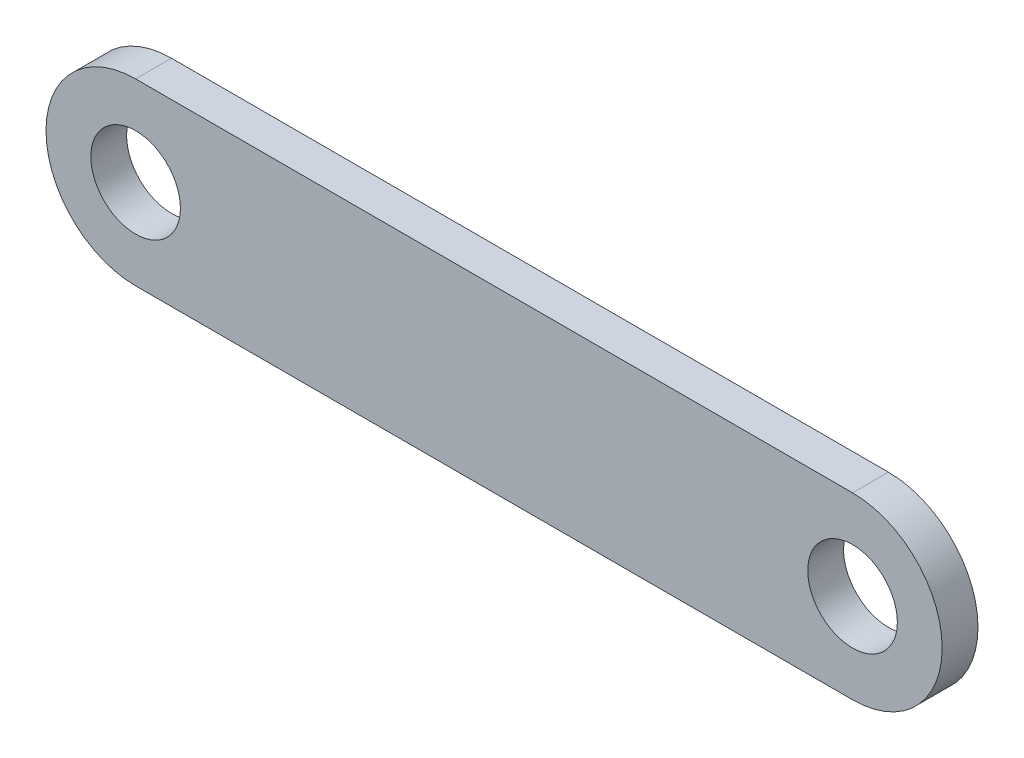
ISO-10303-21;
HEADER;
FILE_DESCRIPTION(('STEP AP214'),'2;1');
FILE_NAME('part.step','',(''),(''),'','','');
FILE_SCHEMA(('AUTOMOTIVE_DESIGN { 1 0 10303 214 1 1 1 1 }'));
ENDSEC;
DATA;
#1=APPLICATION_CONTEXT('core data for automotive mechanical design processes');
#2=APPLICATION_PROTOCOL_DEFINITION('international standard','automotive_design',2000,#1);
#3=PRODUCT_CONTEXT('',#1,'mechanical');
#4=PRODUCT('Part','Part','',(#3));
#5=PRODUCT_RELATED_PRODUCT_CATEGORY('part','',(#4));
#6=PRODUCT_DEFINITION_FORMATION('','',#4);
#7=PRODUCT_DEFINITION_CONTEXT('part definition',#1,'design');
#8=PRODUCT_DEFINITION('design','',#6,#7);
#9=PRODUCT_DEFINITION_SHAPE('','',#8);
#10=(LENGTH_UNIT() NAMED_UNIT(*) SI_UNIT(.MILLI.,.METRE.));
#11=(NAMED_UNIT(*) PLANE_ANGLE_UNIT() SI_UNIT($,.RADIAN.));
#12=(NAMED_UNIT(*) SI_UNIT($,.STERADIAN.) SOLID_ANGLE_UNIT());
#13=UNCERTAINTY_MEASURE_WITH_UNIT(LENGTH_MEASURE(1.E-05),#10,'distance_accuracy_value','');
#14=(GEOMETRIC_REPRESENTATION_CONTEXT(3) GLOBAL_UNCERTAINTY_ASSIGNED_CONTEXT((#13)) GLOBAL_UNIT_ASSIGNED_CONTEXT((#10,
#11,#12)) REPRESENTATION_CONTEXT('',''));
#15=CARTESIAN_POINT('',(0.,0.,0.));
#16=DIRECTION('',(0.,0.,1.));
#17=DIRECTION('',(1.,0.,0.));
#18=AXIS2_PLACEMENT_3D('',#15,#16,#17);
#19=CARTESIAN_POINT('',(0.,0.,2.));
#20=DIRECTION('',(0.,0.,1.));
#21=DIRECTION('',(1.,0.,0.));
#22=AXIS2_PLACEMENT_3D('',#19,#20,#21);
#23=PLANE('',#22);
#24=CARTESIAN_POINT('',(0.,0.,2.));
#25=DIRECTION('',(0.,0.,1.));
#26=DIRECTION('',(1.,0.,0.));
#27=AXIS2_PLACEMENT_3D('',#24,#25,#26);
#28=CIRCLE('',#27,5.);
#29=CARTESIAN_POINT('',(5.,0.,2.));
#30=VERTEX_POINT('',#29);
#31=EDGE_CURVE('E92',#30,#30,#28,.T.);
#32=ORIENTED_EDGE('',*,*,#31,.F.);
#33=EDGE_LOOP('',(#32));
#34=FACE_BOUND('',#33,.T.);
#35=CARTESIAN_POINT('',(0.,0.,2.));
#36=DIRECTION('',(0.,0.,1.));
#37=DIRECTION('',(1.,0.,0.));
#38=AXIS2_PLACEMENT_3D('',#35,#36,#37);
#39=CIRCLE('',#38,10.);
#40=CARTESIAN_POINT('',(0.,10.,2.));
#41=VERTEX_POINT('',#40);
#42=CARTESIAN_POINT('',(0.,-10.,2.));
#43=VERTEX_POINT('',#42);
#44=EDGE_CURVE('E102',#41,#43,#39,.T.);
#45=ORIENTED_EDGE('',*,*,#44,.T.);
#46=DIRECTION('',(1.,0.,0.));
#47=VECTOR('',#46,1.);
#48=CARTESIAN_POINT('',(80.,-9.99999999999999,2.));
#49=LINE('',#48,#47);
#50=CARTESIAN_POINT('',(80.,-9.99999999999999,2.));
#51=VERTEX_POINT('',#50);
#52=EDGE_CURVE('E87',#43,#51,#49,.T.);
#53=ORIENTED_EDGE('',*,*,#52,.T.);
#54=CARTESIAN_POINT('',(80.,0.,2.));
#55=DIRECTION('',(0.,0.,1.));
#56=DIRECTION('',(-1.,0.,0.));
#57=AXIS2_PLACEMENT_3D('',#54,#55,#56);
#58=CIRCLE('',#57,10.);
#59=CARTESIAN_POINT('',(80.,10.,2.));
#60=VERTEX_POINT('',#59);
#61=EDGE_CURVE('E53',#51,#60,#58,.T.);
#62=ORIENTED_EDGE('',*,*,#61,.T.);
#63=DIRECTION('',(-1.,0.,0.));
#64=VECTOR('',#63,1.);
#65=CARTESIAN_POINT('',(0.,10.,2.));
#66=LINE('',#65,#64);
#67=EDGE_CURVE('E48',#60,#41,#66,.T.);
#68=ORIENTED_EDGE('',*,*,#67,.T.);
#69=EDGE_LOOP('',(#45,#53,#62,#68));
#70=FACE_BOUND('',#69,.T.);
#71=CARTESIAN_POINT('',(80.,0.,2.));
#72=DIRECTION('',(0.,0.,1.));
#73=DIRECTION('',(1.,0.,0.));
#74=AXIS2_PLACEMENT_3D('',#71,#72,#73);
#75=CIRCLE('',#74,5.);
#76=CARTESIAN_POINT('',(85.,0.,2.));
#77=VERTEX_POINT('',#76);
#78=EDGE_CURVE('E120',#77,#77,#75,.T.);
#79=ORIENTED_EDGE('',*,*,#78,.F.);
#80=EDGE_LOOP('',(#79));
#81=FACE_BOUND('',#80,.T.);
#82=ADVANCED_FACE('F33',(#34,#70,#81),#23,.T.);
#83=CARTESIAN_POINT('',(0.,0.,-2.));
#84=DIRECTION('',(0.,0.,1.));
#85=DIRECTION('',(1.,0.,0.));
#86=AXIS2_PLACEMENT_3D('',#83,#84,#85);
#87=PLANE('',#86);
#88=CARTESIAN_POINT('',(0.,0.,-2.));
#89=DIRECTION('',(0.,0.,1.));
#90=DIRECTION('',(1.,0.,0.));
#91=AXIS2_PLACEMENT_3D('',#88,#89,#90);
#92=CIRCLE('',#91,5.);
#93=CARTESIAN_POINT('',(5.,0.,-2.));
#94=VERTEX_POINT('',#93);
#95=EDGE_CURVE('E95',#94,#94,#92,.T.);
#96=ORIENTED_EDGE('',*,*,#95,.T.);
#97=EDGE_LOOP('',(#96));
#98=FACE_BOUND('',#97,.T.);
#99=CARTESIAN_POINT('',(0.,0.,-2.));
#100=DIRECTION('',(0.,0.,1.));
#101=DIRECTION('',(1.,0.,0.));
#102=AXIS2_PLACEMENT_3D('',#99,#100,#101);
#103=CIRCLE('',#102,10.);
#104=CARTESIAN_POINT('',(0.,10.,-2.));
#105=VERTEX_POINT('',#104);
#106=CARTESIAN_POINT('',(0.,-10.,-2.));
#107=VERTEX_POINT('',#106);
#108=EDGE_CURVE('E79',#105,#107,#103,.T.);
#109=ORIENTED_EDGE('',*,*,#108,.F.);
#110=DIRECTION('',(-1.,0.,0.));
#111=VECTOR('',#110,1.);
#112=CARTESIAN_POINT('',(0.,10.,-2.));
#113=LINE('',#112,#111);
#114=CARTESIAN_POINT('',(80.,10.,-2.));
#115=VERTEX_POINT('',#114);
#116=EDGE_CURVE('E100',#115,#105,#113,.T.);
#117=ORIENTED_EDGE('',*,*,#116,.F.);
#118=CARTESIAN_POINT('',(80.,0.,-2.));
#119=DIRECTION('',(0.,0.,1.));
#120=DIRECTION('',(-1.,0.,0.));
#121=AXIS2_PLACEMENT_3D('',#118,#119,#120);
#122=CIRCLE('',#121,10.);
#123=CARTESIAN_POINT('',(80.,-9.99999999999999,-2.));
#124=VERTEX_POINT('',#123);
#125=EDGE_CURVE('E80',#124,#115,#122,.T.);
#126=ORIENTED_EDGE('',*,*,#125,.F.);
#127=DIRECTION('',(1.,0.,0.));
#128=VECTOR('',#127,1.);
#129=CARTESIAN_POINT('',(80.,-9.99999999999999,-2.));
#130=LINE('',#129,#128);
#131=EDGE_CURVE('E74',#107,#124,#130,.T.);
#132=ORIENTED_EDGE('',*,*,#131,.F.);
#133=EDGE_LOOP('',(#109,#117,#126,#132));
#134=FACE_BOUND('',#133,.T.);
#135=CARTESIAN_POINT('',(80.,0.,-2.));
#136=DIRECTION('',(0.,0.,1.));
#137=DIRECTION('',(1.,0.,0.));
#138=AXIS2_PLACEMENT_3D('',#135,#136,#137);
#139=CIRCLE('',#138,5.);
#140=CARTESIAN_POINT('',(85.,0.,-2.));
#141=VERTEX_POINT('',#140);
#142=EDGE_CURVE('E122',#141,#141,#139,.T.);
#143=ORIENTED_EDGE('',*,*,#142,.T.);
#144=EDGE_LOOP('',(#143));
#145=FACE_BOUND('',#144,.T.);
#146=ADVANCED_FACE('F75',(#98,#134,#145),#87,.F.);
#147=CARTESIAN_POINT('',(0.,0.,2.));
#148=DIRECTION('',(0.,0.,-1.));
#149=DIRECTION('',(-1.,0.,0.));
#150=AXIS2_PLACEMENT_3D('',#147,#148,#149);
#151=CYLINDRICAL_SURFACE('',#150,10.);
#152=ORIENTED_EDGE('',*,*,#108,.T.);
#153=DIRECTION('',(0.,0.,-1.));
#154=VECTOR('',#153,1.);
#155=CARTESIAN_POINT('',(0.,-10.,2.));
#156=LINE('',#155,#154);
#157=EDGE_CURVE('E11',#43,#107,#156,.T.);
#158=ORIENTED_EDGE('',*,*,#157,.F.);
#159=ORIENTED_EDGE('',*,*,#44,.F.);
#160=DIRECTION('',(0.,0.,-1.));
#161=VECTOR('',#160,1.);
#162=CARTESIAN_POINT('',(0.,10.,2.));
#163=LINE('',#162,#161);
#164=EDGE_CURVE('E91',#41,#105,#163,.T.);
#165=ORIENTED_EDGE('',*,*,#164,.T.);
#166=EDGE_LOOP('',(#152,#158,#159,#165));
#167=FACE_BOUND('',#166,.T.);
#168=ADVANCED_FACE('F35',(#167),#151,.T.);
#169=CARTESIAN_POINT('',(80.,-9.99999999999999,2.));
#170=DIRECTION('',(0.,1.,0.));
#171=DIRECTION('',(-1.,0.,0.));
#172=AXIS2_PLACEMENT_3D('',#169,#170,#171);
#173=PLANE('',#172);
#174=ORIENTED_EDGE('',*,*,#131,.T.);
#175=DIRECTION('',(0.,0.,-1.));
#176=VECTOR('',#175,1.);
#177=CARTESIAN_POINT('',(80.,-9.99999999999999,2.));
#178=LINE('',#177,#176);
#179=EDGE_CURVE('E41',#51,#124,#178,.T.);
#180=ORIENTED_EDGE('',*,*,#179,.F.);
#181=ORIENTED_EDGE('',*,*,#52,.F.);
#182=ORIENTED_EDGE('',*,*,#157,.T.);
#183=EDGE_LOOP('',(#174,#180,#181,#182));
#184=FACE_BOUND('',#183,.T.);
#185=ADVANCED_FACE('F86',(#184),#173,.F.);
#186=CARTESIAN_POINT('',(80.,0.,2.));
#187=DIRECTION('',(0.,0.,-1.));
#188=DIRECTION('',(-1.,0.,0.));
#189=AXIS2_PLACEMENT_3D('',#186,#187,#188);
#190=CYLINDRICAL_SURFACE('',#189,10.);
#191=ORIENTED_EDGE('',*,*,#125,.T.);
#192=DIRECTION('',(0.,0.,-1.));
#193=VECTOR('',#192,1.);
#194=CARTESIAN_POINT('',(80.,10.,2.));
#195=LINE('',#194,#193);
#196=EDGE_CURVE('E108',#60,#115,#195,.T.);
#197=ORIENTED_EDGE('',*,*,#196,.F.);
#198=ORIENTED_EDGE('',*,*,#61,.F.);
#199=ORIENTED_EDGE('',*,*,#179,.T.);
#200=EDGE_LOOP('',(#191,#197,#198,#199));
#201=FACE_BOUND('',#200,.T.);
#202=ADVANCED_FACE('F111',(#201),#190,.T.);
#203=CARTESIAN_POINT('',(0.,10.,2.));
#204=DIRECTION('',(0.,-1.,0.));
#205=DIRECTION('',(0.,0.,-1.));
#206=AXIS2_PLACEMENT_3D('',#203,#204,#205);
#207=PLANE('',#206);
#208=ORIENTED_EDGE('',*,*,#116,.T.);
#209=ORIENTED_EDGE('',*,*,#164,.F.);
#210=ORIENTED_EDGE('',*,*,#67,.F.);
#211=ORIENTED_EDGE('',*,*,#196,.T.);
#212=EDGE_LOOP('',(#208,#209,#210,#211));
#213=FACE_BOUND('',#212,.T.);
#214=ADVANCED_FACE('F113',(#213),#207,.F.);
#215=CARTESIAN_POINT('',(0.,0.,2.));
#216=DIRECTION('',(0.,0.,-1.));
#217=DIRECTION('',(-1.,0.,0.));
#218=AXIS2_PLACEMENT_3D('',#215,#216,#217);
#219=CYLINDRICAL_SURFACE('',#218,5.);
#220=ORIENTED_EDGE('',*,*,#31,.T.);
#221=EDGE_LOOP('',(#220));
#222=FACE_BOUND('',#221,.T.);
#223=ORIENTED_EDGE('',*,*,#95,.F.);
#224=EDGE_LOOP('',(#223));
#225=FACE_BOUND('',#224,.T.);
#226=ADVANCED_FACE('F131',(#222,#225),#219,.F.);
#227=CARTESIAN_POINT('',(80.,0.,2.));
#228=DIRECTION('',(0.,0.,-1.));
#229=DIRECTION('',(-1.,0.,0.));
#230=AXIS2_PLACEMENT_3D('',#227,#228,#229);
#231=CYLINDRICAL_SURFACE('',#230,5.);
#232=ORIENTED_EDGE('',*,*,#78,.T.);
#233=EDGE_LOOP('',(#232));
#234=FACE_BOUND('',#233,.T.);
#235=ORIENTED_EDGE('',*,*,#142,.F.);
#236=EDGE_LOOP('',(#235));
#237=FACE_BOUND('',#236,.T.);
#238=ADVANCED_FACE('F129',(#234,#237),#231,.F.);
#239=CLOSED_SHELL('',(#82,#146,#168,#185,#202,#214,#226,#238));
#240=MANIFOLD_SOLID_BREP('B2',#239);
#241=ADVANCED_BREP_SHAPE_REPRESENTATION('',(#18,#240),#14);
#242=SHAPE_DEFINITION_REPRESENTATION(#9,#241);
ENDSEC;
END-ISO-10303-21;
